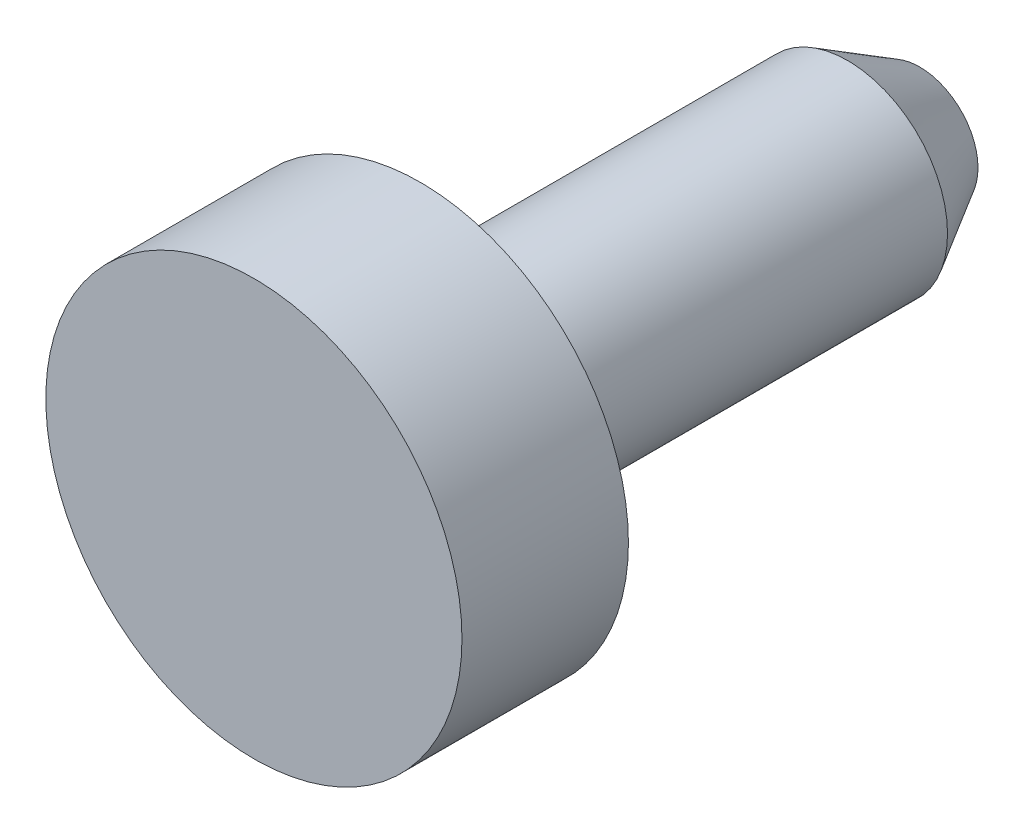
ISO-10303-21;
HEADER;
FILE_DESCRIPTION(('STEP AP214'),'2;1');
FILE_NAME('part.step','',(''),(''),'','','');
FILE_SCHEMA(('AUTOMOTIVE_DESIGN { 1 0 10303 214 1 1 1 1 }'));
ENDSEC;
DATA;
#1=APPLICATION_CONTEXT('core data for automotive mechanical design processes');
#2=APPLICATION_PROTOCOL_DEFINITION('international standard','automotive_design',2000,#1);
#3=PRODUCT_CONTEXT('',#1,'mechanical');
#4=PRODUCT('Part','Part','',(#3));
#5=PRODUCT_RELATED_PRODUCT_CATEGORY('part','',(#4));
#6=PRODUCT_DEFINITION_FORMATION('','',#4);
#7=PRODUCT_DEFINITION_CONTEXT('part definition',#1,'design');
#8=PRODUCT_DEFINITION('design','',#6,#7);
#9=PRODUCT_DEFINITION_SHAPE('','',#8);
#10=(LENGTH_UNIT() NAMED_UNIT(*) SI_UNIT(.MILLI.,.METRE.));
#11=(NAMED_UNIT(*) PLANE_ANGLE_UNIT() SI_UNIT($,.RADIAN.));
#12=(NAMED_UNIT(*) SI_UNIT($,.STERADIAN.) SOLID_ANGLE_UNIT());
#13=UNCERTAINTY_MEASURE_WITH_UNIT(LENGTH_MEASURE(1.E-05),#10,'distance_accuracy_value','');
#14=(GEOMETRIC_REPRESENTATION_CONTEXT(3) GLOBAL_UNCERTAINTY_ASSIGNED_CONTEXT((#13)) GLOBAL_UNIT_ASSIGNED_CONTEXT((#10,
#11,#12)) REPRESENTATION_CONTEXT('',''));
#15=CARTESIAN_POINT('',(0.,0.,0.));
#16=DIRECTION('',(0.,0.,1.));
#17=DIRECTION('',(1.,0.,0.));
#18=AXIS2_PLACEMENT_3D('',#15,#16,#17);
#19=CARTESIAN_POINT('',(0.,0.,2.));
#20=DIRECTION('',(0.,0.,-1.));
#21=DIRECTION('',(-1.,0.,0.));
#22=AXIS2_PLACEMENT_3D('',#19,#20,#21);
#23=CYLINDRICAL_SURFACE('',#22,2.5);
#24=CARTESIAN_POINT('',(0.,0.,2.));
#25=DIRECTION('',(0.,0.,1.));
#26=DIRECTION('',(1.,0.,0.));
#27=AXIS2_PLACEMENT_3D('',#24,#25,#26);
#28=CIRCLE('',#27,2.5);
#29=CARTESIAN_POINT('',(2.5,0.,2.));
#30=VERTEX_POINT('',#29);
#31=EDGE_CURVE('E41',#30,#30,#28,.T.);
#32=ORIENTED_EDGE('',*,*,#31,.F.);
#33=EDGE_LOOP('',(#32));
#34=FACE_BOUND('',#33,.T.);
#35=CARTESIAN_POINT('',(0.,0.,0.));
#36=DIRECTION('',(0.,0.,1.));
#37=DIRECTION('',(1.,0.,0.));
#38=AXIS2_PLACEMENT_3D('',#35,#36,#37);
#39=CIRCLE('',#38,2.5);
#40=CARTESIAN_POINT('',(2.5,0.,0.));
#41=VERTEX_POINT('',#40);
#42=EDGE_CURVE('E45',#41,#41,#39,.T.);
#43=ORIENTED_EDGE('',*,*,#42,.T.);
#44=EDGE_LOOP('',(#43));
#45=FACE_BOUND('',#44,.T.);
#46=ADVANCED_FACE('F30',(#34,#45),#23,.T.);
#47=CARTESIAN_POINT('',(0.,0.,2.));
#48=DIRECTION('',(0.,0.,1.));
#49=DIRECTION('',(1.,0.,0.));
#50=AXIS2_PLACEMENT_3D('',#47,#48,#49);
#51=PLANE('',#50);
#52=ORIENTED_EDGE('',*,*,#31,.T.);
#53=EDGE_LOOP('',(#52));
#54=FACE_BOUND('',#53,.T.);
#55=ADVANCED_FACE('F66',(#54),#51,.T.);
#56=CARTESIAN_POINT('',(0.,0.,0.));
#57=DIRECTION('',(0.,0.,1.));
#58=DIRECTION('',(1.,0.,0.));
#59=AXIS2_PLACEMENT_3D('',#56,#57,#58);
#60=PLANE('',#59);
#61=CARTESIAN_POINT('',(0.,0.,0.));
#62=DIRECTION('',(0.,0.,1.));
#63=DIRECTION('',(1.,0.,0.));
#64=AXIS2_PLACEMENT_3D('',#61,#62,#63);
#65=CIRCLE('',#64,1.2);
#66=CARTESIAN_POINT('',(1.2,0.,0.));
#67=VERTEX_POINT('',#66);
#68=EDGE_CURVE('E49',#67,#67,#65,.T.);
#69=ORIENTED_EDGE('',*,*,#68,.T.);
#70=EDGE_LOOP('',(#69));
#71=FACE_BOUND('',#70,.T.);
#72=ORIENTED_EDGE('',*,*,#42,.F.);
#73=EDGE_LOOP('',(#72));
#74=FACE_BOUND('',#73,.T.);
#75=ADVANCED_FACE('F54',(#71,#74),#60,.F.);
#76=CARTESIAN_POINT('',(0.,0.,-6.));
#77=DIRECTION('',(0.,0.,1.));
#78=DIRECTION('',(1.,0.,0.));
#79=AXIS2_PLACEMENT_3D('',#76,#77,#78);
#80=CYLINDRICAL_SURFACE('',#79,1.2);
#81=CARTESIAN_POINT('',(0.,0.,-5.13397459621556));
#82=DIRECTION('',(0.,0.,1.));
#83=DIRECTION('',(1.,0.,0.));
#84=AXIS2_PLACEMENT_3D('',#81,#82,#83);
#85=CIRCLE('',#84,1.2);
#86=CARTESIAN_POINT('',(1.2,0.,-5.13397459621556));
#87=VERTEX_POINT('',#86);
#88=EDGE_CURVE('E37',#87,#87,#85,.T.);
#89=ORIENTED_EDGE('',*,*,#88,.T.);
#90=EDGE_LOOP('',(#89));
#91=FACE_BOUND('',#90,.T.);
#92=ORIENTED_EDGE('',*,*,#68,.F.);
#93=EDGE_LOOP('',(#92));
#94=FACE_BOUND('',#93,.T.);
#95=ADVANCED_FACE('F57',(#91,#94),#80,.T.);
#96=CARTESIAN_POINT('',(0.,0.,-6.));
#97=DIRECTION('',(0.,0.,1.));
#98=DIRECTION('',(1.,0.,0.));
#99=AXIS2_PLACEMENT_3D('',#96,#97,#98);
#100=PLANE('',#99);
#101=CARTESIAN_POINT('',(0.,0.,-6.));
#102=DIRECTION('',(0.,0.,1.));
#103=DIRECTION('',(1.,0.,0.));
#104=AXIS2_PLACEMENT_3D('',#101,#102,#103);
#105=CIRCLE('',#104,0.699999999999997);
#106=CARTESIAN_POINT('',(0.699999999999996,0.,-6.));
#107=VERTEX_POINT('',#106);
#108=EDGE_CURVE('E10',#107,#107,#105,.F.);
#109=ORIENTED_EDGE('',*,*,#108,.T.);
#110=EDGE_LOOP('',(#109));
#111=FACE_BOUND('',#110,.T.);
#112=ADVANCED_FACE('F59',(#111),#100,.F.);
#113=CARTESIAN_POINT('',(0.,0.,-5.13397459621556));
#114=DIRECTION('',(0.,0.,1.));
#115=DIRECTION('',(1.,0.,0.));
#116=AXIS2_PLACEMENT_3D('',#113,#114,#115);
#117=CONICAL_SURFACE('',#116,1.2,0.523598775598301);
#118=CARTESIAN_POINT('',(0.699999999999996,0.,-6.));
#119=CARTESIAN_POINT('',(0.70520833333333,0.,-5.99097890204391));
#120=CARTESIAN_POINT('',(0.710416666666663,0.,-5.98195780408783));
#121=CARTESIAN_POINT('',(0.72083333333333,0.,-5.96391560817565));
#122=CARTESIAN_POINT('',(0.726041666666663,0.,-5.95489451021956));
#123=CARTESIAN_POINT('',(0.73645833333333,0.,-5.93685231430739));
#124=CARTESIAN_POINT('',(0.741666666666663,0.,-5.9278312163513));
#125=CARTESIAN_POINT('',(0.75208333333333,0.,-5.90978902043912));
#126=CARTESIAN_POINT('',(0.757291666666663,0.,-5.90076792248303));
#127=CARTESIAN_POINT('',(0.76770833333333,0.,-5.88272572657086));
#128=CARTESIAN_POINT('',(0.772916666666663,0.,-5.87370462861477));
#129=CARTESIAN_POINT('',(0.78333333333333,0.,-5.85566243270259));
#130=CARTESIAN_POINT('',(0.788541666666663,0.,-5.84664133474651));
#131=CARTESIAN_POINT('',(0.79895833333333,0.,-5.82859913883433));
#132=CARTESIAN_POINT('',(0.804166666666664,0.,-5.81957804087824));
#133=CARTESIAN_POINT('',(0.81458333333333,0.,-5.80153584496607));
#134=CARTESIAN_POINT('',(0.819791666666664,0.,-5.79251474700998));
#135=CARTESIAN_POINT('',(0.83020833333333,0.,-5.7744725510978));
#136=CARTESIAN_POINT('',(0.835416666666664,0.,-5.76545145314171));
#137=CARTESIAN_POINT('',(0.845833333333331,0.,-5.74740925722954));
#138=CARTESIAN_POINT('',(0.851041666666664,0.,-5.73838815927345));
#139=CARTESIAN_POINT('',(0.861458333333331,0.,-5.72034596336127));
#140=CARTESIAN_POINT('',(0.866666666666664,0.,-5.71132486540519));
#141=CARTESIAN_POINT('',(0.877083333333331,0.,-5.69328266949301));
#142=CARTESIAN_POINT('',(0.882291666666664,0.,-5.68426157153692));
#143=CARTESIAN_POINT('',(0.892708333333331,0.,-5.66621937562475));
#144=CARTESIAN_POINT('',(0.897916666666664,0.,-5.65719827766866));
#145=CARTESIAN_POINT('',(0.908333333333331,0.,-5.63915608175648));
#146=CARTESIAN_POINT('',(0.913541666666664,0.,-5.6301349838004));
#147=CARTESIAN_POINT('',(0.923958333333331,0.,-5.61209278788822));
#148=CARTESIAN_POINT('',(0.929166666666664,0.,-5.60307168993213));
#149=CARTESIAN_POINT('',(0.939583333333331,0.,-5.58502949401996));
#150=CARTESIAN_POINT('',(0.944791666666665,0.,-5.57600839606387));
#151=CARTESIAN_POINT('',(0.955208333333331,0.,-5.55796620015169));
#152=CARTESIAN_POINT('',(0.960416666666665,0.,-5.5489451021956));
#153=CARTESIAN_POINT('',(0.970833333333331,0.,-5.53090290628343));
#154=CARTESIAN_POINT('',(0.976041666666665,0.,-5.52188180832734));
#155=CARTESIAN_POINT('',(0.986458333333332,0.,-5.50383961241516));
#156=CARTESIAN_POINT('',(0.991666666666665,0.,-5.49481851445908));
#157=CARTESIAN_POINT('',(1.00208333333333,0.,-5.4767763185469));
#158=CARTESIAN_POINT('',(1.00729166666666,0.,-5.46775522059081));
#159=CARTESIAN_POINT('',(1.01770833333333,0.,-5.44971302467864));
#160=CARTESIAN_POINT('',(1.02291666666666,0.,-5.44069192672255));
#161=CARTESIAN_POINT('',(1.03333333333333,0.,-5.42264973081037));
#162=CARTESIAN_POINT('',(1.03854166666667,0.,-5.41362863285429));
#163=CARTESIAN_POINT('',(1.04895833333333,0.,-5.39558643694211));
#164=CARTESIAN_POINT('',(1.05416666666667,0.,-5.38656533898602));
#165=CARTESIAN_POINT('',(1.06458333333333,0.,-5.36852314307384));
#166=CARTESIAN_POINT('',(1.06979166666667,0.,-5.35950204511776));
#167=CARTESIAN_POINT('',(1.08020833333333,0.,-5.34145984920558));
#168=CARTESIAN_POINT('',(1.08541666666667,0.,-5.33243875124949));
#169=CARTESIAN_POINT('',(1.09583333333333,0.,-5.31439655533732));
#170=CARTESIAN_POINT('',(1.10104166666667,0.,-5.30537545738123));
#171=CARTESIAN_POINT('',(1.11145833333333,0.,-5.28733326146905));
#172=CARTESIAN_POINT('',(1.11666666666667,0.,-5.27831216351297));
#173=CARTESIAN_POINT('',(1.12708333333333,0.,-5.26026996760079));
#174=CARTESIAN_POINT('',(1.13229166666667,0.,-5.2512488696447));
#175=CARTESIAN_POINT('',(1.14270833333333,0.,-5.23320667373253));
#176=CARTESIAN_POINT('',(1.14791666666667,0.,-5.22418557577644));
#177=CARTESIAN_POINT('',(1.15833333333333,0.,-5.20614337986426));
#178=CARTESIAN_POINT('',(1.16354166666667,0.,-5.19712228190818));
#179=CARTESIAN_POINT('',(1.17395833333333,0.,-5.179080085996));
#180=CARTESIAN_POINT('',(1.17916666666667,0.,-5.17005898803991));
#181=CARTESIAN_POINT('',(1.18958333333333,0.,-5.15201679212773));
#182=CARTESIAN_POINT('',(1.19479166666667,0.,-5.14299569417165));
#183=CARTESIAN_POINT('',(1.2,0.,-5.13397459621556));
#184=B_SPLINE_CURVE_WITH_KNOTS('',3,(#118,#119,#120,#121,#122,#123,#124,#125,#126,#127,#128,
#129,#130,#131,#132,#133,#134,#135,#136,#137,#138,#139,#140,#141,#142,#143,#144,#145,#146,#147,
#148,#149,#150,#151,#152,#153,#154,#155,#156,#157,#158,#159,#160,#161,#162,#163,#164,#165,#166,
#167,#168,#169,#170,#171,#172,#173,#174,#175,#176,#177,#178,#179,#180,#181,#182,#183),
.UNSPECIFIED.,.F.,.F.,(4,2,2,2,2,2,2,2,2,2,2,2,2,2,2,2,2,2,2,2,2,2,2,2,2,2,2,2,2,2,2,2,4),(0.,
0.0312500000000002,0.0625000000000003,0.0937500000000005,0.125000000000001,0.156250000000001,
0.187500000000001,0.218750000000001,0.250000000000001,0.281250000000002,0.312500000000002,
0.343750000000002,0.375000000000002,0.406250000000002,0.437500000000002,0.468750000000002,
0.500000000000002,0.531250000000002,0.562500000000002,0.593750000000002,0.625000000000003,
0.656250000000003,0.687500000000003,0.718750000000003,0.750000000000003,0.781250000000004,
0.812500000000004,0.843750000000004,0.875000000000004,0.906250000000004,0.937500000000005,
0.968750000000005,1.),.UNSPECIFIED.);
#185=EDGE_CURVE('BSEAM32',#107,#87,#184,.T.);
#186=ORIENTED_EDGE('',*,*,#108,.F.);
#187=ORIENTED_EDGE('',*,*,#88,.F.);
#188=ORIENTED_EDGE('',*,*,#185,.T.);
#189=ORIENTED_EDGE('',*,*,#185,.F.);
#190=EDGE_LOOP('',(#186,#188,#187,#189));
#191=FACE_BOUND('',#190,.T.);
#192=ADVANCED_FACE('F32',(#191),#117,.T.);
#193=CLOSED_SHELL('',(#46,#55,#75,#95,#112,#192));
#194=MANIFOLD_SOLID_BREP('B2',#193);
#195=ADVANCED_BREP_SHAPE_REPRESENTATION('',(#18,#194),#14);
#196=SHAPE_DEFINITION_REPRESENTATION(#9,#195);
ENDSEC;
END-ISO-10303-21;
